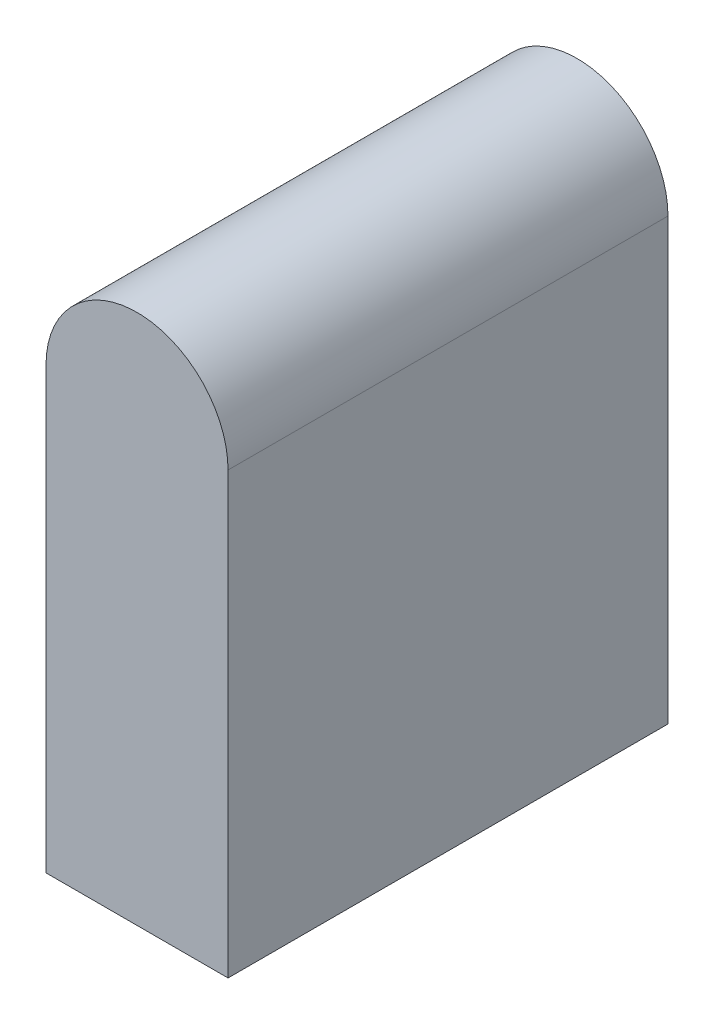
ISO-10303-21;
HEADER;
FILE_DESCRIPTION(('STEP AP214'),'2;1');
FILE_NAME('part.step','',(''),(''),'','','');
FILE_SCHEMA(('AUTOMOTIVE_DESIGN { 1 0 10303 214 1 1 1 1 }'));
ENDSEC;
DATA;
#1=APPLICATION_CONTEXT('core data for automotive mechanical design processes');
#2=APPLICATION_PROTOCOL_DEFINITION('international standard','automotive_design',2000,#1);
#3=PRODUCT_CONTEXT('',#1,'mechanical');
#4=PRODUCT('Part','Part','',(#3));
#5=PRODUCT_RELATED_PRODUCT_CATEGORY('part','',(#4));
#6=PRODUCT_DEFINITION_FORMATION('','',#4);
#7=PRODUCT_DEFINITION_CONTEXT('part definition',#1,'design');
#8=PRODUCT_DEFINITION('design','',#6,#7);
#9=PRODUCT_DEFINITION_SHAPE('','',#8);
#10=(LENGTH_UNIT() NAMED_UNIT(*) SI_UNIT(.MILLI.,.METRE.));
#11=(NAMED_UNIT(*) PLANE_ANGLE_UNIT() SI_UNIT($,.RADIAN.));
#12=(NAMED_UNIT(*) SI_UNIT($,.STERADIAN.) SOLID_ANGLE_UNIT());
#13=UNCERTAINTY_MEASURE_WITH_UNIT(LENGTH_MEASURE(1.E-05),#10,'distance_accuracy_value','');
#14=(GEOMETRIC_REPRESENTATION_CONTEXT(3) GLOBAL_UNCERTAINTY_ASSIGNED_CONTEXT((#13)) GLOBAL_UNIT_ASSIGNED_CONTEXT((#10,
#11,#12)) REPRESENTATION_CONTEXT('',''));
#15=CARTESIAN_POINT('',(0.,0.,0.));
#16=DIRECTION('',(0.,0.,1.));
#17=DIRECTION('',(1.,0.,0.));
#18=AXIS2_PLACEMENT_3D('',#15,#16,#17);
#19=CARTESIAN_POINT('',(0.,-0.6,1.45));
#20=DIRECTION('',(0.,0.,-1.));
#21=DIRECTION('',(-1.,0.,0.));
#22=AXIS2_PLACEMENT_3D('',#19,#20,#21);
#23=CYLINDRICAL_SURFACE('',#22,0.6);
#24=CARTESIAN_POINT('',(0.,-0.6,-1.45));
#25=DIRECTION('',(0.,0.,1.));
#26=DIRECTION('',(-1.,0.,0.));
#27=AXIS2_PLACEMENT_3D('',#24,#25,#26);
#28=CIRCLE('',#27,0.6);
#29=CARTESIAN_POINT('',(0.6,-0.6,-1.45));
#30=VERTEX_POINT('',#29);
#31=CARTESIAN_POINT('',(-0.6,-0.6,-1.45));
#32=VERTEX_POINT('',#31);
#33=EDGE_CURVE('E61',#30,#32,#28,.T.);
#34=ORIENTED_EDGE('',*,*,#33,.T.);
#35=DIRECTION('',(0.,0.,-1.));
#36=VECTOR('',#35,1.);
#37=CARTESIAN_POINT('',(-0.6,-0.6,1.45));
#38=LINE('',#37,#36);
#39=CARTESIAN_POINT('',(-0.6,-0.6,1.45));
#40=VERTEX_POINT('',#39);
#41=EDGE_CURVE('E11',#40,#32,#38,.T.);
#42=ORIENTED_EDGE('',*,*,#41,.F.);
#43=CARTESIAN_POINT('',(0.,-0.6,1.45));
#44=DIRECTION('',(0.,0.,1.));
#45=DIRECTION('',(-1.,0.,0.));
#46=AXIS2_PLACEMENT_3D('',#43,#44,#45);
#47=CIRCLE('',#46,0.6);
#48=CARTESIAN_POINT('',(0.6,-0.6,1.45));
#49=VERTEX_POINT('',#48);
#50=EDGE_CURVE('E79',#49,#40,#47,.T.);
#51=ORIENTED_EDGE('',*,*,#50,.F.);
#52=DIRECTION('',(0.,0.,-1.));
#53=VECTOR('',#52,1.);
#54=CARTESIAN_POINT('',(0.6,-0.6,1.45));
#55=LINE('',#54,#53);
#56=EDGE_CURVE('E73',#49,#30,#55,.T.);
#57=ORIENTED_EDGE('',*,*,#56,.T.);
#58=EDGE_LOOP('',(#34,#42,#51,#57));
#59=FACE_BOUND('',#58,.T.);
#60=ADVANCED_FACE('F17',(#59),#23,.T.);
#61=CARTESIAN_POINT('',(-0.6,-0.6,1.45));
#62=DIRECTION('',(1.,0.,0.));
#63=DIRECTION('',(0.,1.,0.));
#64=AXIS2_PLACEMENT_3D('',#61,#62,#63);
#65=PLANE('',#64);
#66=DIRECTION('',(0.,-1.,0.));
#67=VECTOR('',#66,1.);
#68=CARTESIAN_POINT('',(-0.6,-0.6,-1.45));
#69=LINE('',#68,#67);
#70=CARTESIAN_POINT('',(-0.6,-3.5,-1.45));
#71=VERTEX_POINT('',#70);
#72=EDGE_CURVE('E57',#32,#71,#69,.T.);
#73=ORIENTED_EDGE('',*,*,#72,.T.);
#74=DIRECTION('',(0.,0.,-1.));
#75=VECTOR('',#74,1.);
#76=CARTESIAN_POINT('',(-0.6,-3.5,1.45));
#77=LINE('',#76,#75);
#78=CARTESIAN_POINT('',(-0.6,-3.5,1.45));
#79=VERTEX_POINT('',#78);
#80=EDGE_CURVE('E24',#79,#71,#77,.T.);
#81=ORIENTED_EDGE('',*,*,#80,.F.);
#82=DIRECTION('',(0.,-1.,0.));
#83=VECTOR('',#82,1.);
#84=CARTESIAN_POINT('',(-0.6,-0.6,1.45));
#85=LINE('',#84,#83);
#86=EDGE_CURVE('E69',#40,#79,#85,.T.);
#87=ORIENTED_EDGE('',*,*,#86,.F.);
#88=ORIENTED_EDGE('',*,*,#41,.T.);
#89=EDGE_LOOP('',(#73,#81,#87,#88));
#90=FACE_BOUND('',#89,.T.);
#91=ADVANCED_FACE('F68',(#90),#65,.F.);
#92=CARTESIAN_POINT('',(-0.6,-3.5,1.45));
#93=DIRECTION('',(0.,1.,0.));
#94=DIRECTION('',(0.,0.,1.));
#95=AXIS2_PLACEMENT_3D('',#92,#93,#94);
#96=PLANE('',#95);
#97=DIRECTION('',(1.,0.,0.));
#98=VECTOR('',#97,1.);
#99=CARTESIAN_POINT('',(-0.6,-3.5,-1.45));
#100=LINE('',#99,#98);
#101=CARTESIAN_POINT('',(0.6,-3.5,-1.45));
#102=VERTEX_POINT('',#101);
#103=EDGE_CURVE('E62',#71,#102,#100,.T.);
#104=ORIENTED_EDGE('',*,*,#103,.T.);
#105=DIRECTION('',(0.,0.,-1.));
#106=VECTOR('',#105,1.);
#107=CARTESIAN_POINT('',(0.6,-3.5,1.45));
#108=LINE('',#107,#106);
#109=CARTESIAN_POINT('',(0.6,-3.5,1.45));
#110=VERTEX_POINT('',#109);
#111=EDGE_CURVE('E85',#110,#102,#108,.T.);
#112=ORIENTED_EDGE('',*,*,#111,.F.);
#113=DIRECTION('',(1.,0.,0.));
#114=VECTOR('',#113,1.);
#115=CARTESIAN_POINT('',(-0.6,-3.5,1.45));
#116=LINE('',#115,#114);
#117=EDGE_CURVE('E36',#79,#110,#116,.T.);
#118=ORIENTED_EDGE('',*,*,#117,.F.);
#119=ORIENTED_EDGE('',*,*,#80,.T.);
#120=EDGE_LOOP('',(#104,#112,#118,#119));
#121=FACE_BOUND('',#120,.T.);
#122=ADVANCED_FACE('F88',(#121),#96,.F.);
#123=CARTESIAN_POINT('',(0.6,-0.6,1.45));
#124=DIRECTION('',(-1.,0.,0.));
#125=DIRECTION('',(0.,-1.,0.));
#126=AXIS2_PLACEMENT_3D('',#123,#124,#125);
#127=PLANE('',#126);
#128=DIRECTION('',(0.,1.,0.));
#129=VECTOR('',#128,1.);
#130=CARTESIAN_POINT('',(0.6,-0.6,-1.45));
#131=LINE('',#130,#129);
#132=EDGE_CURVE('E77',#102,#30,#131,.T.);
#133=ORIENTED_EDGE('',*,*,#132,.T.);
#134=ORIENTED_EDGE('',*,*,#56,.F.);
#135=DIRECTION('',(0.,1.,0.));
#136=VECTOR('',#135,1.);
#137=CARTESIAN_POINT('',(0.6,-0.6,1.45));
#138=LINE('',#137,#136);
#139=EDGE_CURVE('E31',#110,#49,#138,.T.);
#140=ORIENTED_EDGE('',*,*,#139,.F.);
#141=ORIENTED_EDGE('',*,*,#111,.T.);
#142=EDGE_LOOP('',(#133,#134,#140,#141));
#143=FACE_BOUND('',#142,.T.);
#144=ADVANCED_FACE('F90',(#143),#127,.F.);
#145=CARTESIAN_POINT('',(0.,-0.6,1.45));
#146=DIRECTION('',(0.,0.,-1.));
#147=DIRECTION('',(-1.,0.,0.));
#148=AXIS2_PLACEMENT_3D('',#145,#146,#147);
#149=PLANE('',#148);
#150=ORIENTED_EDGE('',*,*,#50,.T.);
#151=ORIENTED_EDGE('',*,*,#86,.T.);
#152=ORIENTED_EDGE('',*,*,#117,.T.);
#153=ORIENTED_EDGE('',*,*,#139,.T.);
#154=EDGE_LOOP('',(#150,#151,#152,#153));
#155=FACE_BOUND('',#154,.T.);
#156=ADVANCED_FACE('F91',(#155),#149,.F.);
#157=CARTESIAN_POINT('',(0.,-0.6,-1.45));
#158=DIRECTION('',(0.,0.,-1.));
#159=DIRECTION('',(-1.,0.,0.));
#160=AXIS2_PLACEMENT_3D('',#157,#158,#159);
#161=PLANE('',#160);
#162=ORIENTED_EDGE('',*,*,#33,.F.);
#163=ORIENTED_EDGE('',*,*,#132,.F.);
#164=ORIENTED_EDGE('',*,*,#103,.F.);
#165=ORIENTED_EDGE('',*,*,#72,.F.);
#166=EDGE_LOOP('',(#162,#163,#164,#165));
#167=FACE_BOUND('',#166,.T.);
#168=ADVANCED_FACE('F58',(#167),#161,.T.);
#169=CLOSED_SHELL('',(#60,#91,#122,#144,#156,#168));
#170=MANIFOLD_SOLID_BREP('B1',#169);
#171=ADVANCED_BREP_SHAPE_REPRESENTATION('',(#18,#170),#14);
#172=SHAPE_DEFINITION_REPRESENTATION(#9,#171);
ENDSEC;
END-ISO-10303-21;
